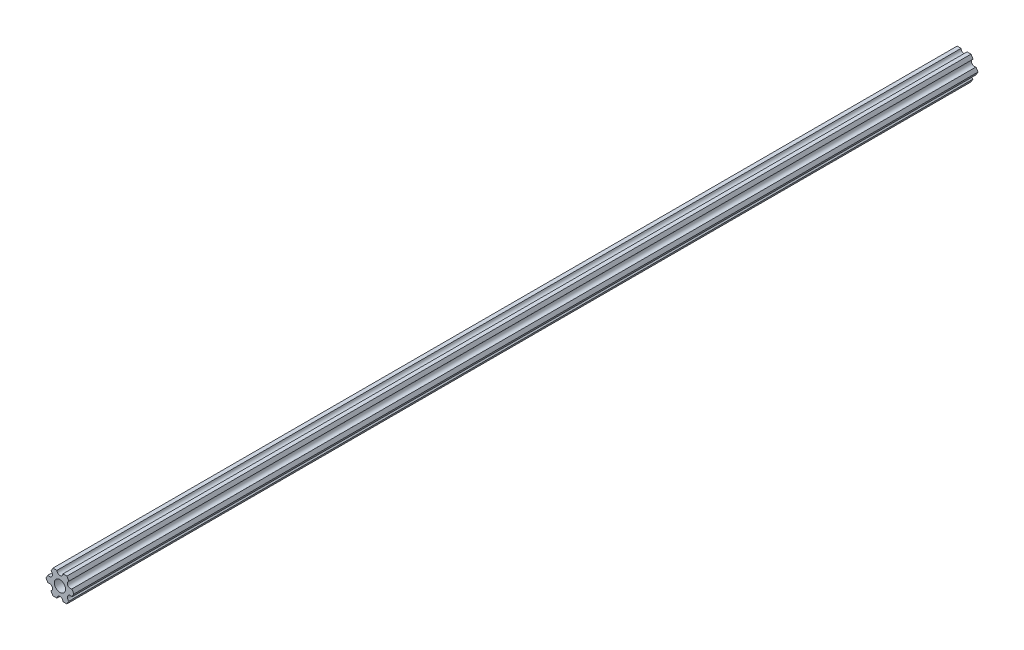
ISO-10303-21;
HEADER;
FILE_DESCRIPTION(('STEP AP214'),'2;1');
FILE_NAME('part.step','',(''),(''),'','','');
FILE_SCHEMA(('AUTOMOTIVE_DESIGN { 1 0 10303 214 1 1 1 1 }'));
ENDSEC;
DATA;
#1=APPLICATION_CONTEXT('core data for automotive mechanical design processes');
#2=APPLICATION_PROTOCOL_DEFINITION('international standard','automotive_design',2000,#1);
#3=PRODUCT_CONTEXT('',#1,'mechanical');
#4=PRODUCT('Part','Part','',(#3));
#5=PRODUCT_RELATED_PRODUCT_CATEGORY('part','',(#4));
#6=PRODUCT_DEFINITION_FORMATION('','',#4);
#7=PRODUCT_DEFINITION_CONTEXT('part definition',#1,'design');
#8=PRODUCT_DEFINITION('design','',#6,#7);
#9=PRODUCT_DEFINITION_SHAPE('','',#8);
#10=(LENGTH_UNIT() NAMED_UNIT(*) SI_UNIT(.MILLI.,.METRE.));
#11=(NAMED_UNIT(*) PLANE_ANGLE_UNIT() SI_UNIT($,.RADIAN.));
#12=(NAMED_UNIT(*) SI_UNIT($,.STERADIAN.) SOLID_ANGLE_UNIT());
#13=UNCERTAINTY_MEASURE_WITH_UNIT(LENGTH_MEASURE(1.E-05),#10,'distance_accuracy_value','');
#14=(GEOMETRIC_REPRESENTATION_CONTEXT(3) GLOBAL_UNCERTAINTY_ASSIGNED_CONTEXT((#13)) GLOBAL_UNIT_ASSIGNED_CONTEXT((#10,
#11,#12)) REPRESENTATION_CONTEXT('',''));
#15=CARTESIAN_POINT('',(0.,0.,0.));
#16=DIRECTION('',(0.,0.,1.));
#17=DIRECTION('',(1.,0.,0.));
#18=AXIS2_PLACEMENT_3D('',#15,#16,#17);
#19=CARTESIAN_POINT('',(5.49926169873049,-3.17500022210629,-231.775));
#20=DIRECTION('',(0.,0.,1.));
#21=DIRECTION('',(1.,0.,0.));
#22=AXIS2_PLACEMENT_3D('',#19,#20,#21);
#23=CYLINDRICAL_SURFACE('',#22,1.5875);
#24=CARTESIAN_POINT('',(5.49926169873049,-3.17500022210629,244.475));
#25=DIRECTION('',(0.,0.,-1.));
#26=DIRECTION('',(-1.,0.,0.));
#27=AXIS2_PLACEMENT_3D('',#24,#25,#26);
#28=CIRCLE('',#27,1.5875);
#29=CARTESIAN_POINT('',(4.70551169873051,-4.5498155506141,244.475));
#30=VERTEX_POINT('',#29);
#31=CARTESIAN_POINT('',(6.29301169873047,-1.80018489359848,244.475));
#32=VERTEX_POINT('',#31);
#33=EDGE_CURVE('E124',#30,#32,#28,.T.);
#34=ORIENTED_EDGE('',*,*,#33,.F.);
#35=DIRECTION('',(0.,0.,1.));
#36=VECTOR('',#35,1.);
#37=CARTESIAN_POINT('',(4.70551169873051,-4.5498155506141,-231.775));
#38=LINE('',#37,#36);
#39=CARTESIAN_POINT('',(4.70551169873051,-4.5498155506141,-231.775));
#40=VERTEX_POINT('',#39);
#41=EDGE_CURVE('E12',#40,#30,#38,.T.);
#42=ORIENTED_EDGE('',*,*,#41,.F.);
#43=CARTESIAN_POINT('',(5.49926169873049,-3.17500022210629,-231.775));
#44=DIRECTION('',(0.,0.,-1.));
#45=DIRECTION('',(-1.,0.,0.));
#46=AXIS2_PLACEMENT_3D('',#43,#44,#45);
#47=CIRCLE('',#46,1.5875);
#48=CARTESIAN_POINT('',(6.29301169873047,-1.80018489359848,-231.775));
#49=VERTEX_POINT('',#48);
#50=EDGE_CURVE('E126',#40,#49,#47,.T.);
#51=ORIENTED_EDGE('',*,*,#50,.T.);
#52=DIRECTION('',(0.,0.,1.));
#53=VECTOR('',#52,1.);
#54=CARTESIAN_POINT('',(6.29301169873047,-1.80018489359848,-231.775));
#55=LINE('',#54,#53);
#56=EDGE_CURVE('E122',#49,#32,#55,.T.);
#57=ORIENTED_EDGE('',*,*,#56,.T.);
#58=EDGE_LOOP('',(#34,#42,#51,#57));
#59=FACE_BOUND('',#58,.T.);
#60=ADVANCED_FACE('F40',(#59),#23,.F.);
#61=CARTESIAN_POINT('',(3.6661745940535,-6.35000022210627,-231.775));
#62=DIRECTION('',(0.866025403784445,-0.499999999999988,0.));
#63=DIRECTION('',(0.499999999999988,0.866025403784446,0.));
#64=AXIS2_PLACEMENT_3D('',#61,#62,#63);
#65=PLANE('',#64);
#66=DIRECTION('',(0.499999999999988,0.866025403784445,0.));
#67=VECTOR('',#66,1.);
#68=CARTESIAN_POINT('',(3.6661745940535,-6.35000022210627,244.475));
#69=LINE('',#68,#67);
#70=CARTESIAN_POINT('',(3.6661745940535,-6.35000022210627,244.475));
#71=VERTEX_POINT('',#70);
#72=EDGE_CURVE('E139',#71,#30,#69,.T.);
#73=ORIENTED_EDGE('',*,*,#72,.F.);
#74=DIRECTION('',(0.,0.,1.));
#75=VECTOR('',#74,1.);
#76=CARTESIAN_POINT('',(3.6661745940535,-6.35000022210627,-231.775));
#77=LINE('',#76,#75);
#78=CARTESIAN_POINT('',(3.6661745940535,-6.35000022210627,-231.775));
#79=VERTEX_POINT('',#78);
#80=EDGE_CURVE('E51',#79,#71,#77,.T.);
#81=ORIENTED_EDGE('',*,*,#80,.F.);
#82=DIRECTION('',(0.499999999999988,0.866025403784445,0.));
#83=VECTOR('',#82,1.);
#84=CARTESIAN_POINT('',(3.6661745940535,-6.35000022210627,-231.775));
#85=LINE('',#84,#83);
#86=EDGE_CURVE('E129',#79,#40,#85,.T.);
#87=ORIENTED_EDGE('',*,*,#86,.T.);
#88=ORIENTED_EDGE('',*,*,#41,.T.);
#89=EDGE_LOOP('',(#73,#81,#87,#88));
#90=FACE_BOUND('',#89,.T.);
#91=ADVANCED_FACE('F353',(#90),#65,.T.);
#92=CARTESIAN_POINT('',(1.58750038469929,-6.35000022210627,-231.775));
#93=DIRECTION('',(0.,-1.,0.));
#94=DIRECTION('',(0.,0.,-1.));
#95=AXIS2_PLACEMENT_3D('',#92,#93,#94);
#96=PLANE('',#95);
#97=DIRECTION('',(1.,0.,0.));
#98=VECTOR('',#97,1.);
#99=CARTESIAN_POINT('',(1.58750038469929,-6.35000022210627,244.475));
#100=LINE('',#99,#98);
#101=CARTESIAN_POINT('',(1.58750038469929,-6.35000022210627,244.475));
#102=VERTEX_POINT('',#101);
#103=EDGE_CURVE('E151',#102,#71,#100,.T.);
#104=ORIENTED_EDGE('',*,*,#103,.F.);
#105=DIRECTION('',(0.,0.,1.));
#106=VECTOR('',#105,1.);
#107=CARTESIAN_POINT('',(1.58750038469929,-6.35000022210627,-231.775));
#108=LINE('',#107,#106);
#109=CARTESIAN_POINT('',(1.58750038469929,-6.35000022210627,-231.775));
#110=VERTEX_POINT('',#109);
#111=EDGE_CURVE('E340',#110,#102,#108,.T.);
#112=ORIENTED_EDGE('',*,*,#111,.F.);
#113=DIRECTION('',(1.,0.,0.));
#114=VECTOR('',#113,1.);
#115=CARTESIAN_POINT('',(1.58750038469929,-6.35000022210627,-231.775));
#116=LINE('',#115,#114);
#117=EDGE_CURVE('E358',#110,#79,#116,.T.);
#118=ORIENTED_EDGE('',*,*,#117,.T.);
#119=ORIENTED_EDGE('',*,*,#80,.T.);
#120=EDGE_LOOP('',(#104,#112,#118,#119));
#121=FACE_BOUND('',#120,.T.);
#122=ADVANCED_FACE('F351',(#121),#96,.T.);
#123=CARTESIAN_POINT('',(3.84699292685064E-07,-6.35000022210627,-231.775));
#124=DIRECTION('',(0.,0.,1.));
#125=DIRECTION('',(1.,0.,0.));
#126=AXIS2_PLACEMENT_3D('',#123,#124,#125);
#127=CYLINDRICAL_SURFACE('',#126,1.5875);
#128=CARTESIAN_POINT('',(3.84699292685064E-07,-6.35000022210627,244.475));
#129=DIRECTION('',(0.,0.,-1.));
#130=DIRECTION('',(-1.,0.,0.));
#131=AXIS2_PLACEMENT_3D('',#128,#129,#130);
#132=CIRCLE('',#131,1.5875);
#133=CARTESIAN_POINT('',(-1.58749961530071,-6.35000022210627,244.475));
#134=VERTEX_POINT('',#133);
#135=EDGE_CURVE('E154',#134,#102,#132,.T.);
#136=ORIENTED_EDGE('',*,*,#135,.F.);
#137=DIRECTION('',(0.,0.,1.));
#138=VECTOR('',#137,1.);
#139=CARTESIAN_POINT('',(-1.58749961530071,-6.35000022210627,-231.775));
#140=LINE('',#139,#138);
#141=CARTESIAN_POINT('',(-1.58749961530071,-6.35000022210627,-231.775));
#142=VERTEX_POINT('',#141);
#143=EDGE_CURVE('E333',#142,#134,#140,.T.);
#144=ORIENTED_EDGE('',*,*,#143,.F.);
#145=CARTESIAN_POINT('',(3.84699292685064E-07,-6.35000022210627,-231.775));
#146=DIRECTION('',(0.,0.,-1.));
#147=DIRECTION('',(-1.,0.,0.));
#148=AXIS2_PLACEMENT_3D('',#145,#146,#147);
#149=CIRCLE('',#148,1.5875);
#150=EDGE_CURVE('E345',#142,#110,#149,.T.);
#151=ORIENTED_EDGE('',*,*,#150,.T.);
#152=ORIENTED_EDGE('',*,*,#111,.T.);
#153=EDGE_LOOP('',(#136,#144,#151,#152));
#154=FACE_BOUND('',#153,.T.);
#155=ADVANCED_FACE('F342',(#154),#127,.F.);
#156=CARTESIAN_POINT('',(-3.66617382465478,-6.35000022210627,-231.775));
#157=DIRECTION('',(0.,-1.,0.));
#158=DIRECTION('',(1.,0.,0.));
#159=AXIS2_PLACEMENT_3D('',#156,#157,#158);
#160=PLANE('',#159);
#161=DIRECTION('',(1.,0.,0.));
#162=VECTOR('',#161,1.);
#163=CARTESIAN_POINT('',(-3.66617382465478,-6.35000022210627,244.475));
#164=LINE('',#163,#162);
#165=CARTESIAN_POINT('',(-3.66617382465478,-6.35000022210627,244.475));
#166=VERTEX_POINT('',#165);
#167=EDGE_CURVE('E158',#166,#134,#164,.T.);
#168=ORIENTED_EDGE('',*,*,#167,.F.);
#169=DIRECTION('',(0.,0.,1.));
#170=VECTOR('',#169,1.);
#171=CARTESIAN_POINT('',(-3.66617382465478,-6.35000022210627,-231.775));
#172=LINE('',#171,#170);
#173=CARTESIAN_POINT('',(-3.66617382465478,-6.35000022210627,-231.775));
#174=VERTEX_POINT('',#173);
#175=EDGE_CURVE('E321',#174,#166,#172,.T.);
#176=ORIENTED_EDGE('',*,*,#175,.F.);
#177=DIRECTION('',(1.,0.,0.));
#178=VECTOR('',#177,1.);
#179=CARTESIAN_POINT('',(-3.66617382465478,-6.35000022210627,-231.775));
#180=LINE('',#179,#178);
#181=EDGE_CURVE('E335',#174,#142,#180,.T.);
#182=ORIENTED_EDGE('',*,*,#181,.T.);
#183=ORIENTED_EDGE('',*,*,#143,.T.);
#184=EDGE_LOOP('',(#168,#176,#182,#183));
#185=FACE_BOUND('',#184,.T.);
#186=ADVANCED_FACE('F328',(#185),#160,.T.);
#187=CARTESIAN_POINT('',(-4.70551103839171,-4.54981561357971,-231.775));
#188=DIRECTION('',(-0.866025373493149,-0.500000052466048,0.));
#189=DIRECTION('',(0.500000052466048,-0.866025373493149,0.));
#190=AXIS2_PLACEMENT_3D('',#187,#188,#189);
#191=PLANE('',#190);
#192=DIRECTION('',(0.500000052466048,-0.866025373493149,0.));
#193=VECTOR('',#192,1.);
#194=CARTESIAN_POINT('',(-4.70551103839171,-4.54981561357971,244.475));
#195=LINE('',#194,#193);
#196=CARTESIAN_POINT('',(-4.70551103839171,-4.54981561357971,244.475));
#197=VERTEX_POINT('',#196);
#198=EDGE_CURVE('E162',#197,#166,#195,.T.);
#199=ORIENTED_EDGE('',*,*,#198,.F.);
#200=DIRECTION('',(0.,0.,1.));
#201=VECTOR('',#200,1.);
#202=CARTESIAN_POINT('',(-4.70551103839171,-4.54981561357971,-231.775));
#203=LINE('',#202,#201);
#204=CARTESIAN_POINT('',(-4.70551103839171,-4.54981561357971,-231.775));
#205=VERTEX_POINT('',#204);
#206=EDGE_CURVE('E310',#205,#197,#203,.T.);
#207=ORIENTED_EDGE('',*,*,#206,.F.);
#208=DIRECTION('',(0.500000052466048,-0.866025373493149,0.));
#209=VECTOR('',#208,1.);
#210=CARTESIAN_POINT('',(-4.70551103839171,-4.54981561357971,-231.775));
#211=LINE('',#210,#209);
#212=EDGE_CURVE('E379',#205,#174,#211,.T.);
#213=ORIENTED_EDGE('',*,*,#212,.T.);
#214=ORIENTED_EDGE('',*,*,#175,.T.);
#215=EDGE_LOOP('',(#199,#207,#213,#214));
#216=FACE_BOUND('',#215,.T.);
#217=ADVANCED_FACE('F323',(#216),#191,.T.);
#218=CARTESIAN_POINT('',(-5.49926112168156,-3.17500033315934,-231.775));
#219=DIRECTION('',(0.,0.,1.));
#220=DIRECTION('',(1.,0.,0.));
#221=AXIS2_PLACEMENT_3D('',#218,#219,#220);
#222=CYLINDRICAL_SURFACE('',#221,1.5875);
#223=CARTESIAN_POINT('',(-5.49926112168156,-3.17500033315934,244.475));
#224=DIRECTION('',(0.,0.,-1.));
#225=DIRECTION('',(-1.,0.,0.));
#226=AXIS2_PLACEMENT_3D('',#223,#224,#225);
#227=CIRCLE('',#226,1.5875);
#228=CARTESIAN_POINT('',(-6.29301120497141,-1.80018505273897,244.475));
#229=VERTEX_POINT('',#228);
#230=EDGE_CURVE('E166',#229,#197,#227,.T.);
#231=ORIENTED_EDGE('',*,*,#230,.F.);
#232=DIRECTION('',(0.,0.,1.));
#233=VECTOR('',#232,1.);
#234=CARTESIAN_POINT('',(-6.29301120497141,-1.80018505273897,-231.775));
#235=LINE('',#234,#233);
#236=CARTESIAN_POINT('',(-6.29301120497141,-1.80018505273897,-231.775));
#237=VERTEX_POINT('',#236);
#238=EDGE_CURVE('E303',#237,#229,#235,.T.);
#239=ORIENTED_EDGE('',*,*,#238,.F.);
#240=CARTESIAN_POINT('',(-5.49926112168156,-3.17500033315934,-231.775));
#241=DIRECTION('',(0.,0.,-1.));
#242=DIRECTION('',(-1.,0.,0.));
#243=AXIS2_PLACEMENT_3D('',#240,#241,#242);
#244=CIRCLE('',#243,1.5875);
#245=EDGE_CURVE('E316',#237,#205,#244,.T.);
#246=ORIENTED_EDGE('',*,*,#245,.T.);
#247=ORIENTED_EDGE('',*,*,#206,.T.);
#248=EDGE_LOOP('',(#231,#239,#246,#247));
#249=FACE_BOUND('',#248,.T.);
#250=ADVANCED_FACE('F312',(#249),#222,.F.);
#251=CARTESIAN_POINT('',(-7.33234841870827,-4.44212523790841E-07,-231.775));
#252=DIRECTION('',(-0.866025373493149,-0.500000052466049,0.));
#253=DIRECTION('',(0.500000052466048,-0.866025373493149,0.));
#254=AXIS2_PLACEMENT_3D('',#251,#252,#253);
#255=PLANE('',#254);
#256=DIRECTION('',(0.500000052466048,-0.866025373493149,0.));
#257=VECTOR('',#256,1.);
#258=CARTESIAN_POINT('',(-7.33234841870827,-4.44212523790841E-07,244.475));
#259=LINE('',#258,#257);
#260=CARTESIAN_POINT('',(-7.33234841870827,-4.44212523790841E-07,244.475));
#261=VERTEX_POINT('',#260);
#262=EDGE_CURVE('E170',#261,#229,#259,.T.);
#263=ORIENTED_EDGE('',*,*,#262,.F.);
#264=DIRECTION('',(0.,0.,1.));
#265=VECTOR('',#264,1.);
#266=CARTESIAN_POINT('',(-7.33234841870827,-4.44212523790841E-07,-231.775));
#267=LINE('',#266,#265);
#268=CARTESIAN_POINT('',(-7.33234841870827,-4.44212523790841E-07,-231.775));
#269=VERTEX_POINT('',#268);
#270=EDGE_CURVE('E291',#269,#261,#267,.T.);
#271=ORIENTED_EDGE('',*,*,#270,.F.);
#272=DIRECTION('',(0.500000052466048,-0.866025373493149,0.));
#273=VECTOR('',#272,1.);
#274=CARTESIAN_POINT('',(-7.33234841870827,-4.44212523790841E-07,-231.775));
#275=LINE('',#274,#273);
#276=EDGE_CURVE('E305',#269,#237,#275,.T.);
#277=ORIENTED_EDGE('',*,*,#276,.T.);
#278=ORIENTED_EDGE('',*,*,#238,.T.);
#279=EDGE_LOOP('',(#263,#271,#277,#278));
#280=FACE_BOUND('',#279,.T.);
#281=ADVANCED_FACE('F298',(#280),#255,.T.);
#282=CARTESIAN_POINT('',(-6.29301142309098,1.80018429024547,-231.775));
#283=DIRECTION('',(-0.866025434075722,0.499999947533954,0.));
#284=DIRECTION('',(-0.499999947533955,-0.866025434075722,0.));
#285=AXIS2_PLACEMENT_3D('',#282,#283,#284);
#286=PLANE('',#285);
#287=DIRECTION('',(-0.499999947533955,-0.866025434075722,0.));
#288=VECTOR('',#287,1.);
#289=CARTESIAN_POINT('',(-6.29301142309098,1.80018429024547,244.475));
#290=LINE('',#289,#288);
#291=CARTESIAN_POINT('',(-6.29301142309098,1.80018429024546,244.475));
#292=VERTEX_POINT('',#291);
#293=EDGE_CURVE('E174',#292,#261,#290,.T.);
#294=ORIENTED_EDGE('',*,*,#293,.F.);
#295=DIRECTION('',(0.,0.,1.));
#296=VECTOR('',#295,1.);
#297=CARTESIAN_POINT('',(-6.29301142309098,1.80018429024546,-231.775));
#298=LINE('',#297,#296);
#299=CARTESIAN_POINT('',(-6.29301142309098,1.80018429024546,-231.775));
#300=VERTEX_POINT('',#299);
#301=EDGE_CURVE('E280',#300,#292,#298,.T.);
#302=ORIENTED_EDGE('',*,*,#301,.F.);
#303=DIRECTION('',(-0.499999947533955,-0.866025434075722,0.));
#304=VECTOR('',#303,1.);
#305=CARTESIAN_POINT('',(-6.29301142309098,1.80018429024547,-231.775));
#306=LINE('',#305,#304);
#307=EDGE_CURVE('E386',#300,#269,#306,.T.);
#308=ORIENTED_EDGE('',*,*,#307,.T.);
#309=ORIENTED_EDGE('',*,*,#270,.T.);
#310=EDGE_LOOP('',(#294,#302,#308,#309));
#311=FACE_BOUND('',#310,.T.);
#312=ADVANCED_FACE('F293',(#311),#286,.T.);
#313=CARTESIAN_POINT('',(-5.49926150638083,3.17499966684067,-231.775));
#314=DIRECTION('',(0.,0.,1.));
#315=DIRECTION('',(1.,0.,0.));
#316=AXIS2_PLACEMENT_3D('',#313,#314,#315);
#317=CYLINDRICAL_SURFACE('',#316,1.5875);
#318=CARTESIAN_POINT('',(-5.49926150638083,3.17499966684067,244.475));
#319=DIRECTION('',(0.,0.,-1.));
#320=DIRECTION('',(-1.,0.,0.));
#321=AXIS2_PLACEMENT_3D('',#318,#319,#320);
#322=CIRCLE('',#321,1.5875);
#323=CARTESIAN_POINT('',(-4.70551158967067,4.54981504343588,244.475));
#324=VERTEX_POINT('',#323);
#325=EDGE_CURVE('E178',#324,#292,#322,.T.);
#326=ORIENTED_EDGE('',*,*,#325,.F.);
#327=DIRECTION('',(0.,0.,1.));
#328=VECTOR('',#327,1.);
#329=CARTESIAN_POINT('',(-4.70551158967067,4.54981504343588,-231.775));
#330=LINE('',#329,#328);
#331=CARTESIAN_POINT('',(-4.70551158967067,4.54981504343588,-231.775));
#332=VERTEX_POINT('',#331);
#333=EDGE_CURVE('E273',#332,#324,#330,.T.);
#334=ORIENTED_EDGE('',*,*,#333,.F.);
#335=CARTESIAN_POINT('',(-5.49926150638083,3.17499966684067,-231.775));
#336=DIRECTION('',(0.,0.,-1.));
#337=DIRECTION('',(-1.,0.,0.));
#338=AXIS2_PLACEMENT_3D('',#335,#336,#337);
#339=CIRCLE('',#338,1.5875);
#340=EDGE_CURVE('E286',#332,#300,#339,.T.);
#341=ORIENTED_EDGE('',*,*,#340,.T.);
#342=ORIENTED_EDGE('',*,*,#301,.T.);
#343=EDGE_LOOP('',(#326,#334,#341,#342));
#344=FACE_BOUND('',#343,.T.);
#345=ADVANCED_FACE('F282',(#344),#317,.F.);
#346=CARTESIAN_POINT('',(-3.66617459405348,6.3499997778937,-231.775));
#347=DIRECTION('',(-0.866025434075722,0.499999947533955,0.));
#348=DIRECTION('',(-0.499999947533955,-0.866025434075722,0.));
#349=AXIS2_PLACEMENT_3D('',#346,#347,#348);
#350=PLANE('',#349);
#351=DIRECTION('',(-0.499999947533955,-0.866025434075722,0.));
#352=VECTOR('',#351,1.);
#353=CARTESIAN_POINT('',(-3.66617459405348,6.3499997778937,244.475));
#354=LINE('',#353,#352);
#355=CARTESIAN_POINT('',(-3.66617459405348,6.3499997778937,244.475));
#356=VERTEX_POINT('',#355);
#357=EDGE_CURVE('E182',#356,#324,#354,.T.);
#358=ORIENTED_EDGE('',*,*,#357,.F.);
#359=DIRECTION('',(0.,0.,1.));
#360=VECTOR('',#359,1.);
#361=CARTESIAN_POINT('',(-3.66617459405348,6.3499997778937,-231.775));
#362=LINE('',#361,#360);
#363=CARTESIAN_POINT('',(-3.66617459405348,6.3499997778937,-231.775));
#364=VERTEX_POINT('',#363);
#365=EDGE_CURVE('E261',#364,#356,#362,.T.);
#366=ORIENTED_EDGE('',*,*,#365,.F.);
#367=DIRECTION('',(-0.499999947533955,-0.866025434075722,0.));
#368=VECTOR('',#367,1.);
#369=CARTESIAN_POINT('',(-3.66617459405348,6.3499997778937,-231.775));
#370=LINE('',#369,#368);
#371=EDGE_CURVE('E275',#364,#332,#370,.T.);
#372=ORIENTED_EDGE('',*,*,#371,.T.);
#373=ORIENTED_EDGE('',*,*,#333,.T.);
#374=EDGE_LOOP('',(#358,#366,#372,#373));
#375=FACE_BOUND('',#374,.T.);
#376=ADVANCED_FACE('F268',(#375),#350,.T.);
#377=CARTESIAN_POINT('',(-1.58750038469926,6.3499997778937,-231.775));
#378=DIRECTION('',(0.,1.,0.));
#379=DIRECTION('',(0.,0.,1.));
#380=AXIS2_PLACEMENT_3D('',#377,#378,#379);
#381=PLANE('',#380);
#382=DIRECTION('',(-1.,0.,0.));
#383=VECTOR('',#382,1.);
#384=CARTESIAN_POINT('',(-1.58750038469926,6.3499997778937,244.475));
#385=LINE('',#384,#383);
#386=CARTESIAN_POINT('',(-1.58750038469926,6.3499997778937,244.475));
#387=VERTEX_POINT('',#386);
#388=EDGE_CURVE('E186',#387,#356,#385,.T.);
#389=ORIENTED_EDGE('',*,*,#388,.F.);
#390=DIRECTION('',(0.,0.,1.));
#391=VECTOR('',#390,1.);
#392=CARTESIAN_POINT('',(-1.58750038469926,6.3499997778937,-231.775));
#393=LINE('',#392,#391);
#394=CARTESIAN_POINT('',(-1.58750038469926,6.3499997778937,-231.775));
#395=VERTEX_POINT('',#394);
#396=EDGE_CURVE('E250',#395,#387,#393,.T.);
#397=ORIENTED_EDGE('',*,*,#396,.F.);
#398=DIRECTION('',(-1.,0.,0.));
#399=VECTOR('',#398,1.);
#400=CARTESIAN_POINT('',(-1.58750038469926,6.3499997778937,-231.775));
#401=LINE('',#400,#399);
#402=EDGE_CURVE('E393',#395,#364,#401,.T.);
#403=ORIENTED_EDGE('',*,*,#402,.T.);
#404=ORIENTED_EDGE('',*,*,#365,.T.);
#405=EDGE_LOOP('',(#389,#397,#403,#404));
#406=FACE_BOUND('',#405,.T.);
#407=ADVANCED_FACE('F263',(#406),#381,.T.);
#408=CARTESIAN_POINT('',(-3.84699252021695E-07,6.3499997778937,-231.775));
#409=DIRECTION('',(0.,0.,1.));
#410=DIRECTION('',(1.,0.,0.));
#411=AXIS2_PLACEMENT_3D('',#408,#409,#410);
#412=CYLINDRICAL_SURFACE('',#411,1.5875);
#413=CARTESIAN_POINT('',(-3.84699252021695E-07,6.3499997778937,244.475));
#414=DIRECTION('',(0.,0.,-1.));
#415=DIRECTION('',(-1.,0.,0.));
#416=AXIS2_PLACEMENT_3D('',#413,#414,#415);
#417=CIRCLE('',#416,1.5875);
#418=CARTESIAN_POINT('',(1.58749961530075,6.3499997778937,244.475));
#419=VERTEX_POINT('',#418);
#420=EDGE_CURVE('E190',#419,#387,#417,.T.);
#421=ORIENTED_EDGE('',*,*,#420,.F.);
#422=DIRECTION('',(0.,0.,1.));
#423=VECTOR('',#422,1.);
#424=CARTESIAN_POINT('',(1.58749961530075,6.3499997778937,-231.775));
#425=LINE('',#424,#423);
#426=CARTESIAN_POINT('',(1.58749961530075,6.3499997778937,-231.775));
#427=VERTEX_POINT('',#426);
#428=EDGE_CURVE('E243',#427,#419,#425,.T.);
#429=ORIENTED_EDGE('',*,*,#428,.F.);
#430=CARTESIAN_POINT('',(-3.84699252021695E-07,6.3499997778937,-231.775));
#431=DIRECTION('',(0.,0.,-1.));
#432=DIRECTION('',(-1.,0.,0.));
#433=AXIS2_PLACEMENT_3D('',#430,#431,#432);
#434=CIRCLE('',#433,1.5875);
#435=EDGE_CURVE('E256',#427,#395,#434,.T.);
#436=ORIENTED_EDGE('',*,*,#435,.T.);
#437=ORIENTED_EDGE('',*,*,#396,.T.);
#438=EDGE_LOOP('',(#421,#429,#436,#437));
#439=FACE_BOUND('',#438,.T.);
#440=ADVANCED_FACE('F252',(#439),#412,.F.);
#441=CARTESIAN_POINT('',(3.66617382465482,6.3499997778937,-231.775));
#442=DIRECTION('',(0.,1.,0.));
#443=DIRECTION('',(-1.,0.,0.));
#444=AXIS2_PLACEMENT_3D('',#441,#442,#443);
#445=PLANE('',#444);
#446=DIRECTION('',(-1.,0.,0.));
#447=VECTOR('',#446,1.);
#448=CARTESIAN_POINT('',(3.66617382465482,6.3499997778937,244.475));
#449=LINE('',#448,#447);
#450=CARTESIAN_POINT('',(3.66617382465482,6.3499997778937,244.475));
#451=VERTEX_POINT('',#450);
#452=EDGE_CURVE('E194',#451,#419,#449,.T.);
#453=ORIENTED_EDGE('',*,*,#452,.F.);
#454=DIRECTION('',(0.,0.,1.));
#455=VECTOR('',#454,1.);
#456=CARTESIAN_POINT('',(3.66617382465482,6.3499997778937,-231.775));
#457=LINE('',#456,#455);
#458=CARTESIAN_POINT('',(3.66617382465482,6.3499997778937,-231.775));
#459=VERTEX_POINT('',#458);
#460=EDGE_CURVE('E231',#459,#451,#457,.T.);
#461=ORIENTED_EDGE('',*,*,#460,.F.);
#462=DIRECTION('',(-1.,0.,0.));
#463=VECTOR('',#462,1.);
#464=CARTESIAN_POINT('',(3.66617382465482,6.3499997778937,-231.775));
#465=LINE('',#464,#463);
#466=EDGE_CURVE('E245',#459,#427,#465,.T.);
#467=ORIENTED_EDGE('',*,*,#466,.T.);
#468=ORIENTED_EDGE('',*,*,#428,.T.);
#469=EDGE_LOOP('',(#453,#461,#467,#468));
#470=FACE_BOUND('',#469,.T.);
#471=ADVANCED_FACE('F238',(#470),#445,.T.);
#472=CARTESIAN_POINT('',(4.70551118909645,4.54981503427037,-231.775));
#473=DIRECTION('',(0.866025358347508,0.500000078699063,0.));
#474=DIRECTION('',(-0.500000078699064,0.866025358347508,0.));
#475=AXIS2_PLACEMENT_3D('',#472,#473,#474);
#476=PLANE('',#475);
#477=DIRECTION('',(-0.500000078699064,0.866025358347508,0.));
#478=VECTOR('',#477,1.);
#479=CARTESIAN_POINT('',(4.70551118909645,4.54981503427037,244.475));
#480=LINE('',#479,#478);
#481=CARTESIAN_POINT('',(4.70551118909645,4.54981503427037,244.475));
#482=VERTEX_POINT('',#481);
#483=EDGE_CURVE('E198',#482,#451,#480,.T.);
#484=ORIENTED_EDGE('',*,*,#483,.F.);
#485=DIRECTION('',(0.,0.,1.));
#486=VECTOR('',#485,1.);
#487=CARTESIAN_POINT('',(4.70551118909645,4.54981503427037,-231.775));
#488=LINE('',#487,#486);
#489=CARTESIAN_POINT('',(4.70551118909645,4.54981503427037,-231.775));
#490=VERTEX_POINT('',#489);
#491=EDGE_CURVE('E220',#490,#482,#488,.T.);
#492=ORIENTED_EDGE('',*,*,#491,.F.);
#493=DIRECTION('',(-0.500000078699064,0.866025358347508,0.));
#494=VECTOR('',#493,1.);
#495=CARTESIAN_POINT('',(4.70551118909645,4.54981503427037,-231.775));
#496=LINE('',#495,#494);
#497=EDGE_CURVE('E400',#490,#459,#496,.T.);
#498=ORIENTED_EDGE('',*,*,#497,.T.);
#499=ORIENTED_EDGE('',*,*,#460,.T.);
#500=EDGE_LOOP('',(#484,#492,#498,#499));
#501=FACE_BOUND('',#500,.T.);
#502=ADVANCED_FACE('F233',(#501),#476,.T.);
#503=CARTESIAN_POINT('',(5.49926131403122,3.1749997778937,-231.775));
#504=DIRECTION('',(0.,0.,1.));
#505=DIRECTION('',(1.,0.,0.));
#506=AXIS2_PLACEMENT_3D('',#503,#504,#505);
#507=CYLINDRICAL_SURFACE('',#506,1.5875);
#508=CARTESIAN_POINT('',(5.49926131403122,3.1749997778937,244.475));
#509=DIRECTION('',(0.,0.,-1.));
#510=DIRECTION('',(-1.,0.,0.));
#511=AXIS2_PLACEMENT_3D('',#508,#509,#510);
#512=CIRCLE('',#511,1.5875);
#513=CARTESIAN_POINT('',(6.29301143896598,1.80018452151703,244.475));
#514=VERTEX_POINT('',#513);
#515=EDGE_CURVE('E202',#514,#482,#512,.T.);
#516=ORIENTED_EDGE('',*,*,#515,.F.);
#517=DIRECTION('',(0.,0.,1.));
#518=VECTOR('',#517,1.);
#519=CARTESIAN_POINT('',(6.29301143896598,1.80018452151703,-231.775));
#520=LINE('',#519,#518);
#521=CARTESIAN_POINT('',(6.29301143896598,1.80018452151703,-231.775));
#522=VERTEX_POINT('',#521);
#523=EDGE_CURVE('E213',#522,#514,#520,.T.);
#524=ORIENTED_EDGE('',*,*,#523,.F.);
#525=CARTESIAN_POINT('',(5.49926131403122,3.1749997778937,-231.775));
#526=DIRECTION('',(0.,0.,-1.));
#527=DIRECTION('',(-1.,0.,0.));
#528=AXIS2_PLACEMENT_3D('',#525,#526,#527);
#529=CIRCLE('',#528,1.5875);
#530=EDGE_CURVE('E226',#522,#490,#529,.T.);
#531=ORIENTED_EDGE('',*,*,#530,.T.);
#532=ORIENTED_EDGE('',*,*,#491,.T.);
#533=EDGE_LOOP('',(#516,#524,#531,#532));
#534=FACE_BOUND('',#533,.T.);
#535=ADVANCED_FACE('F222',(#534),#507,.F.);
#536=CARTESIAN_POINT('',(7.33234880340755,-2.22106193541899E-07,-231.775));
#537=DIRECTION('',(0.866025358347508,0.500000078699065,0.));
#538=DIRECTION('',(-0.500000078699065,0.866025358347508,0.));
#539=AXIS2_PLACEMENT_3D('',#536,#537,#538);
#540=PLANE('',#539);
#541=DIRECTION('',(-0.500000078699065,0.866025358347508,0.));
#542=VECTOR('',#541,1.);
#543=CARTESIAN_POINT('',(7.33234880340755,-2.22106193541899E-07,244.475));
#544=LINE('',#543,#542);
#545=CARTESIAN_POINT('',(7.33234880340755,-2.22106193541899E-07,244.475));
#546=VERTEX_POINT('',#545);
#547=EDGE_CURVE('E136',#546,#514,#544,.T.);
#548=ORIENTED_EDGE('',*,*,#547,.F.);
#549=DIRECTION('',(0.,0.,1.));
#550=VECTOR('',#549,1.);
#551=CARTESIAN_POINT('',(7.33234880340755,-2.22106193541899E-07,-231.775));
#552=LINE('',#551,#550);
#553=CARTESIAN_POINT('',(7.33234880340755,-2.22106193541899E-07,-231.775));
#554=VERTEX_POINT('',#553);
#555=EDGE_CURVE('E118',#554,#546,#552,.T.);
#556=ORIENTED_EDGE('',*,*,#555,.F.);
#557=DIRECTION('',(-0.500000078699065,0.866025358347508,0.));
#558=VECTOR('',#557,1.);
#559=CARTESIAN_POINT('',(7.33234880340755,-2.22106193541899E-07,-231.775));
#560=LINE('',#559,#558);
#561=EDGE_CURVE('E215',#554,#522,#560,.T.);
#562=ORIENTED_EDGE('',*,*,#561,.T.);
#563=ORIENTED_EDGE('',*,*,#523,.T.);
#564=EDGE_LOOP('',(#548,#556,#562,#563));
#565=FACE_BOUND('',#564,.T.);
#566=ADVANCED_FACE('F208',(#565),#540,.T.);
#567=CARTESIAN_POINT('',(6.29301169873047,-1.80018489359848,-231.775));
#568=DIRECTION('',(0.866025403784445,-0.499999999999989,0.));
#569=DIRECTION('',(0.499999999999989,0.866025403784445,0.));
#570=AXIS2_PLACEMENT_3D('',#567,#568,#569);
#571=PLANE('',#570);
#572=DIRECTION('',(0.499999999999989,0.866025403784445,0.));
#573=VECTOR('',#572,1.);
#574=CARTESIAN_POINT('',(6.29301169873047,-1.80018489359848,244.475));
#575=LINE('',#574,#573);
#576=EDGE_CURVE('E44',#32,#546,#575,.T.);
#577=ORIENTED_EDGE('',*,*,#576,.F.);
#578=ORIENTED_EDGE('',*,*,#56,.F.);
#579=DIRECTION('',(0.499999999999989,0.866025403784445,0.));
#580=VECTOR('',#579,1.);
#581=CARTESIAN_POINT('',(6.29301169873047,-1.80018489359848,-231.775));
#582=LINE('',#581,#580);
#583=EDGE_CURVE('E407',#49,#554,#582,.T.);
#584=ORIENTED_EDGE('',*,*,#583,.T.);
#585=ORIENTED_EDGE('',*,*,#555,.T.);
#586=EDGE_LOOP('',(#577,#578,#584,#585));
#587=FACE_BOUND('',#586,.T.);
#588=ADVANCED_FACE('F132',(#587),#571,.T.);
#589=CARTESIAN_POINT('',(5.49926169873049,-3.17500022210629,-231.775));
#590=DIRECTION('',(0.,0.,-1.));
#591=DIRECTION('',(-1.,0.,0.));
#592=AXIS2_PLACEMENT_3D('',#589,#590,#591);
#593=PLANE('',#592);
#594=CARTESIAN_POINT('',(0.,0.,-231.775));
#595=DIRECTION('',(0.,0.,1.));
#596=DIRECTION('',(-1.,0.,0.));
#597=AXIS2_PLACEMENT_3D('',#594,#595,#596);
#598=CIRCLE('',#597,2.9337);
#599=CARTESIAN_POINT('',(-2.9337,0.,-231.775));
#600=VERTEX_POINT('',#599);
#601=EDGE_CURVE('E141',#600,#600,#598,.T.);
#602=ORIENTED_EDGE('',*,*,#601,.T.);
#603=EDGE_LOOP('',(#602));
#604=FACE_BOUND('',#603,.T.);
#605=ORIENTED_EDGE('',*,*,#50,.F.);
#606=ORIENTED_EDGE('',*,*,#86,.F.);
#607=ORIENTED_EDGE('',*,*,#117,.F.);
#608=ORIENTED_EDGE('',*,*,#150,.F.);
#609=ORIENTED_EDGE('',*,*,#181,.F.);
#610=ORIENTED_EDGE('',*,*,#212,.F.);
#611=ORIENTED_EDGE('',*,*,#245,.F.);
#612=ORIENTED_EDGE('',*,*,#276,.F.);
#613=ORIENTED_EDGE('',*,*,#307,.F.);
#614=ORIENTED_EDGE('',*,*,#340,.F.);
#615=ORIENTED_EDGE('',*,*,#371,.F.);
#616=ORIENTED_EDGE('',*,*,#402,.F.);
#617=ORIENTED_EDGE('',*,*,#435,.F.);
#618=ORIENTED_EDGE('',*,*,#466,.F.);
#619=ORIENTED_EDGE('',*,*,#497,.F.);
#620=ORIENTED_EDGE('',*,*,#530,.F.);
#621=ORIENTED_EDGE('',*,*,#561,.F.);
#622=ORIENTED_EDGE('',*,*,#583,.F.);
#623=EDGE_LOOP('',(#605,#606,#607,#608,#609,#610,#611,#612,#613,#614,#615,#616,#617,#618,#619,
#620,#621,#622));
#624=FACE_BOUND('',#623,.T.);
#625=ADVANCED_FACE('F412',(#604,#624),#593,.T.);
#626=CARTESIAN_POINT('',(5.49926169873049,-3.17500022210629,244.475));
#627=DIRECTION('',(0.,0.,-1.));
#628=DIRECTION('',(-1.,0.,0.));
#629=AXIS2_PLACEMENT_3D('',#626,#627,#628);
#630=PLANE('',#629);
#631=CARTESIAN_POINT('',(0.,0.,244.475));
#632=DIRECTION('',(0.,0.,1.));
#633=DIRECTION('',(-1.,0.,0.));
#634=AXIS2_PLACEMENT_3D('',#631,#632,#633);
#635=CIRCLE('',#634,2.9337);
#636=CARTESIAN_POINT('',(-2.9337,0.,244.475));
#637=VERTEX_POINT('',#636);
#638=EDGE_CURVE('E145',#637,#637,#635,.T.);
#639=ORIENTED_EDGE('',*,*,#638,.F.);
#640=EDGE_LOOP('',(#639));
#641=FACE_BOUND('',#640,.T.);
#642=ORIENTED_EDGE('',*,*,#33,.T.);
#643=ORIENTED_EDGE('',*,*,#576,.T.);
#644=ORIENTED_EDGE('',*,*,#547,.T.);
#645=ORIENTED_EDGE('',*,*,#515,.T.);
#646=ORIENTED_EDGE('',*,*,#483,.T.);
#647=ORIENTED_EDGE('',*,*,#452,.T.);
#648=ORIENTED_EDGE('',*,*,#420,.T.);
#649=ORIENTED_EDGE('',*,*,#388,.T.);
#650=ORIENTED_EDGE('',*,*,#357,.T.);
#651=ORIENTED_EDGE('',*,*,#325,.T.);
#652=ORIENTED_EDGE('',*,*,#293,.T.);
#653=ORIENTED_EDGE('',*,*,#262,.T.);
#654=ORIENTED_EDGE('',*,*,#230,.T.);
#655=ORIENTED_EDGE('',*,*,#198,.T.);
#656=ORIENTED_EDGE('',*,*,#167,.T.);
#657=ORIENTED_EDGE('',*,*,#135,.T.);
#658=ORIENTED_EDGE('',*,*,#103,.T.);
#659=ORIENTED_EDGE('',*,*,#72,.T.);
#660=EDGE_LOOP('',(#642,#643,#644,#645,#646,#647,#648,#649,#650,#651,#652,#653,#654,#655,#656,
#657,#658,#659));
#661=FACE_BOUND('',#660,.T.);
#662=ADVANCED_FACE('F42',(#641,#661),#630,.F.);
#663=CARTESIAN_POINT('',(0.,0.,-231.775));
#664=DIRECTION('',(0.,0.,1.));
#665=DIRECTION('',(1.,0.,0.));
#666=AXIS2_PLACEMENT_3D('',#663,#664,#665);
#667=CYLINDRICAL_SURFACE('',#666,2.9337);
#668=ORIENTED_EDGE('',*,*,#601,.F.);
#669=EDGE_LOOP('',(#668));
#670=FACE_BOUND('',#669,.T.);
#671=ORIENTED_EDGE('',*,*,#638,.T.);
#672=EDGE_LOOP('',(#671));
#673=FACE_BOUND('',#672,.T.);
#674=ADVANCED_FACE('F434',(#670,#673),#667,.F.);
#675=CLOSED_SHELL('',(#60,#91,#122,#155,#186,#217,#250,#281,#312,#345,#376,#407,#440,#471,#502,
#535,#566,#588,#625,#662,#674));
#676=MANIFOLD_SOLID_BREP('B2',#675);
#677=ADVANCED_BREP_SHAPE_REPRESENTATION('',(#18,#676),#14);
#678=SHAPE_DEFINITION_REPRESENTATION(#9,#677);
ENDSEC;
END-ISO-10303-21;
